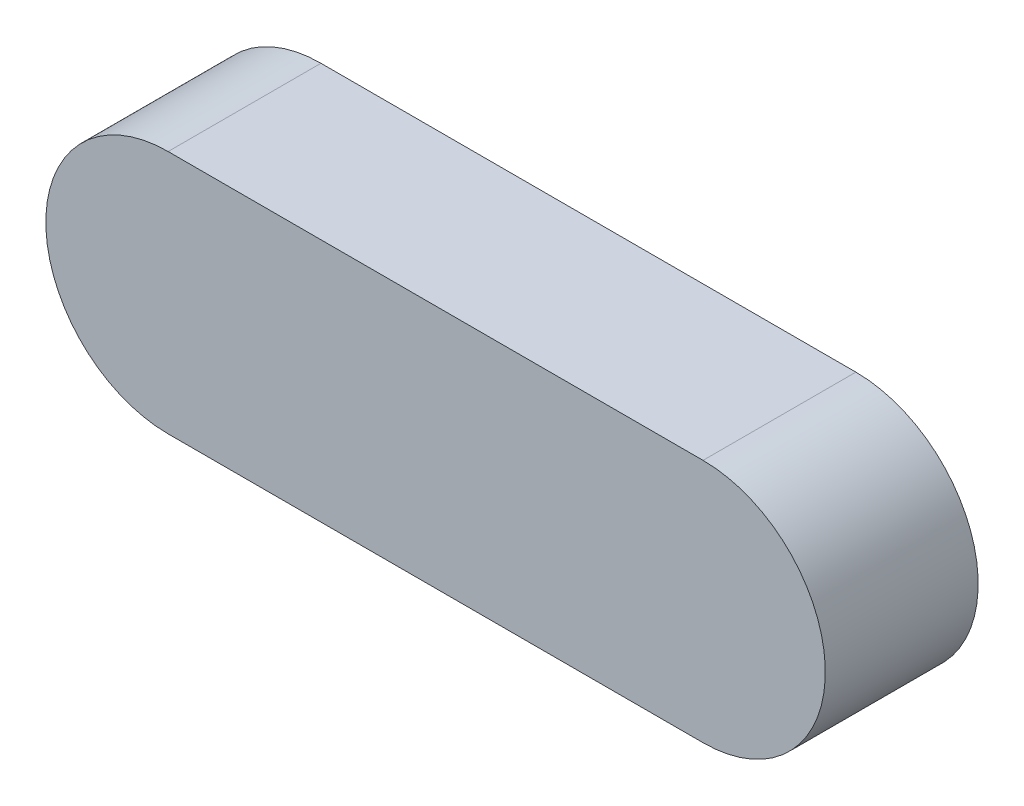
ISO-10303-21;
HEADER;
FILE_DESCRIPTION(('STEP AP214'),'2;1');
FILE_NAME('part.step','',(''),(''),'','','');
FILE_SCHEMA(('AUTOMOTIVE_DESIGN { 1 0 10303 214 1 1 1 1 }'));
ENDSEC;
DATA;
#1=APPLICATION_CONTEXT('core data for automotive mechanical design processes');
#2=APPLICATION_PROTOCOL_DEFINITION('international standard','automotive_design',2000,#1);
#3=PRODUCT_CONTEXT('',#1,'mechanical');
#4=PRODUCT('Part','Part','',(#3));
#5=PRODUCT_RELATED_PRODUCT_CATEGORY('part','',(#4));
#6=PRODUCT_DEFINITION_FORMATION('','',#4);
#7=PRODUCT_DEFINITION_CONTEXT('part definition',#1,'design');
#8=PRODUCT_DEFINITION('design','',#6,#7);
#9=PRODUCT_DEFINITION_SHAPE('','',#8);
#10=(LENGTH_UNIT() NAMED_UNIT(*) SI_UNIT(.MILLI.,.METRE.));
#11=(NAMED_UNIT(*) PLANE_ANGLE_UNIT() SI_UNIT($,.RADIAN.));
#12=(NAMED_UNIT(*) SI_UNIT($,.STERADIAN.) SOLID_ANGLE_UNIT());
#13=UNCERTAINTY_MEASURE_WITH_UNIT(LENGTH_MEASURE(1.E-05),#10,'distance_accuracy_value','');
#14=(GEOMETRIC_REPRESENTATION_CONTEXT(3) GLOBAL_UNCERTAINTY_ASSIGNED_CONTEXT((#13)) GLOBAL_UNIT_ASSIGNED_CONTEXT((#10,
#11,#12)) REPRESENTATION_CONTEXT('',''));
#15=CARTESIAN_POINT('',(0.,0.,0.));
#16=DIRECTION('',(0.,0.,1.));
#17=DIRECTION('',(1.,0.,0.));
#18=AXIS2_PLACEMENT_3D('',#15,#16,#17);
#19=CARTESIAN_POINT('',(-35.,0.,20.));
#20=DIRECTION('',(0.,0.,-1.));
#21=DIRECTION('',(-1.,0.,0.));
#22=AXIS2_PLACEMENT_3D('',#19,#20,#21);
#23=CYLINDRICAL_SURFACE('',#22,16.);
#24=CARTESIAN_POINT('',(-35.,0.,0.));
#25=DIRECTION('',(0.,0.,1.));
#26=DIRECTION('',(1.,0.,0.));
#27=AXIS2_PLACEMENT_3D('',#24,#25,#26);
#28=CIRCLE('',#27,16.);
#29=CARTESIAN_POINT('',(-35.,16.,0.));
#30=VERTEX_POINT('',#29);
#31=CARTESIAN_POINT('',(-35.,-16.,0.));
#32=VERTEX_POINT('',#31);
#33=EDGE_CURVE('E96',#30,#32,#28,.T.);
#34=ORIENTED_EDGE('',*,*,#33,.T.);
#35=DIRECTION('',(0.,0.,-1.));
#36=VECTOR('',#35,1.);
#37=CARTESIAN_POINT('',(-35.,-16.,20.));
#38=LINE('',#37,#36);
#39=CARTESIAN_POINT('',(-35.,-16.,20.));
#40=VERTEX_POINT('',#39);
#41=EDGE_CURVE('E11',#40,#32,#38,.T.);
#42=ORIENTED_EDGE('',*,*,#41,.F.);
#43=CARTESIAN_POINT('',(-35.,0.,20.));
#44=DIRECTION('',(0.,0.,1.));
#45=DIRECTION('',(1.,0.,0.));
#46=AXIS2_PLACEMENT_3D('',#43,#44,#45);
#47=CIRCLE('',#46,16.);
#48=CARTESIAN_POINT('',(-35.,16.,20.));
#49=VERTEX_POINT('',#48);
#50=EDGE_CURVE('E84',#49,#40,#47,.T.);
#51=ORIENTED_EDGE('',*,*,#50,.F.);
#52=DIRECTION('',(0.,0.,-1.));
#53=VECTOR('',#52,1.);
#54=CARTESIAN_POINT('',(-35.,16.,20.));
#55=LINE('',#54,#53);
#56=EDGE_CURVE('E92',#49,#30,#55,.T.);
#57=ORIENTED_EDGE('',*,*,#56,.T.);
#58=EDGE_LOOP('',(#34,#42,#51,#57));
#59=FACE_BOUND('',#58,.T.);
#60=ADVANCED_FACE('F33',(#59),#23,.T.);
#61=CARTESIAN_POINT('',(-35.,-16.,20.));
#62=DIRECTION('',(0.,1.,0.));
#63=DIRECTION('',(0.,0.,1.));
#64=AXIS2_PLACEMENT_3D('',#61,#62,#63);
#65=PLANE('',#64);
#66=DIRECTION('',(1.,0.,0.));
#67=VECTOR('',#66,1.);
#68=CARTESIAN_POINT('',(-35.,-16.,0.));
#69=LINE('',#68,#67);
#70=CARTESIAN_POINT('',(35.,-16.,0.));
#71=VERTEX_POINT('',#70);
#72=EDGE_CURVE('E88',#32,#71,#69,.T.);
#73=ORIENTED_EDGE('',*,*,#72,.T.);
#74=DIRECTION('',(0.,0.,-1.));
#75=VECTOR('',#74,1.);
#76=CARTESIAN_POINT('',(35.,-16.,20.));
#77=LINE('',#76,#75);
#78=CARTESIAN_POINT('',(35.,-16.,20.));
#79=VERTEX_POINT('',#78);
#80=EDGE_CURVE('E41',#79,#71,#77,.T.);
#81=ORIENTED_EDGE('',*,*,#80,.F.);
#82=DIRECTION('',(1.,0.,0.));
#83=VECTOR('',#82,1.);
#84=CARTESIAN_POINT('',(-35.,-16.,20.));
#85=LINE('',#84,#83);
#86=EDGE_CURVE('E79',#40,#79,#85,.T.);
#87=ORIENTED_EDGE('',*,*,#86,.F.);
#88=ORIENTED_EDGE('',*,*,#41,.T.);
#89=EDGE_LOOP('',(#73,#81,#87,#88));
#90=FACE_BOUND('',#89,.T.);
#91=ADVANCED_FACE('F87',(#90),#65,.F.);
#92=CARTESIAN_POINT('',(35.,0.,20.));
#93=DIRECTION('',(0.,0.,-1.));
#94=DIRECTION('',(-1.,0.,0.));
#95=AXIS2_PLACEMENT_3D('',#92,#93,#94);
#96=CYLINDRICAL_SURFACE('',#95,16.);
#97=CARTESIAN_POINT('',(35.,0.,0.));
#98=DIRECTION('',(0.,0.,1.));
#99=DIRECTION('',(-1.,0.,0.));
#100=AXIS2_PLACEMENT_3D('',#97,#98,#99);
#101=CIRCLE('',#100,16.);
#102=CARTESIAN_POINT('',(35.,16.,0.));
#103=VERTEX_POINT('',#102);
#104=EDGE_CURVE('E66',#71,#103,#101,.T.);
#105=ORIENTED_EDGE('',*,*,#104,.T.);
#106=DIRECTION('',(0.,0.,-1.));
#107=VECTOR('',#106,1.);
#108=CARTESIAN_POINT('',(35.,16.,20.));
#109=LINE('',#108,#107);
#110=CARTESIAN_POINT('',(35.,16.,20.));
#111=VERTEX_POINT('',#110);
#112=EDGE_CURVE('E89',#111,#103,#109,.T.);
#113=ORIENTED_EDGE('',*,*,#112,.F.);
#114=CARTESIAN_POINT('',(35.,0.,20.));
#115=DIRECTION('',(0.,0.,1.));
#116=DIRECTION('',(-1.,0.,0.));
#117=AXIS2_PLACEMENT_3D('',#114,#115,#116);
#118=CIRCLE('',#117,16.);
#119=EDGE_CURVE('E82',#79,#111,#118,.T.);
#120=ORIENTED_EDGE('',*,*,#119,.F.);
#121=ORIENTED_EDGE('',*,*,#80,.T.);
#122=EDGE_LOOP('',(#105,#113,#120,#121));
#123=FACE_BOUND('',#122,.T.);
#124=ADVANCED_FACE('F90',(#123),#96,.T.);
#125=CARTESIAN_POINT('',(-35.,16.,20.));
#126=DIRECTION('',(0.,-1.,0.));
#127=DIRECTION('',(0.,0.,-1.));
#128=AXIS2_PLACEMENT_3D('',#125,#126,#127);
#129=PLANE('',#128);
#130=DIRECTION('',(-1.,0.,0.));
#131=VECTOR('',#130,1.);
#132=CARTESIAN_POINT('',(-35.,16.,0.));
#133=LINE('',#132,#131);
#134=EDGE_CURVE('E72',#103,#30,#133,.T.);
#135=ORIENTED_EDGE('',*,*,#134,.T.);
#136=ORIENTED_EDGE('',*,*,#56,.F.);
#137=DIRECTION('',(-1.,0.,0.));
#138=VECTOR('',#137,1.);
#139=CARTESIAN_POINT('',(-35.,16.,20.));
#140=LINE('',#139,#138);
#141=EDGE_CURVE('E49',#111,#49,#140,.T.);
#142=ORIENTED_EDGE('',*,*,#141,.F.);
#143=ORIENTED_EDGE('',*,*,#112,.T.);
#144=EDGE_LOOP('',(#135,#136,#142,#143));
#145=FACE_BOUND('',#144,.T.);
#146=ADVANCED_FACE('F103',(#145),#129,.F.);
#147=CARTESIAN_POINT('',(-35.,0.,20.));
#148=DIRECTION('',(0.,0.,1.));
#149=DIRECTION('',(1.,0.,0.));
#150=AXIS2_PLACEMENT_3D('',#147,#148,#149);
#151=PLANE('',#150);
#152=ORIENTED_EDGE('',*,*,#50,.T.);
#153=ORIENTED_EDGE('',*,*,#86,.T.);
#154=ORIENTED_EDGE('',*,*,#119,.T.);
#155=ORIENTED_EDGE('',*,*,#141,.T.);
#156=EDGE_LOOP('',(#152,#153,#154,#155));
#157=FACE_BOUND('',#156,.T.);
#158=ADVANCED_FACE('F80',(#157),#151,.T.);
#159=CARTESIAN_POINT('',(-35.,0.,0.));
#160=DIRECTION('',(0.,0.,1.));
#161=DIRECTION('',(1.,0.,0.));
#162=AXIS2_PLACEMENT_3D('',#159,#160,#161);
#163=PLANE('',#162);
#164=ORIENTED_EDGE('',*,*,#33,.F.);
#165=ORIENTED_EDGE('',*,*,#134,.F.);
#166=ORIENTED_EDGE('',*,*,#104,.F.);
#167=ORIENTED_EDGE('',*,*,#72,.F.);
#168=EDGE_LOOP('',(#164,#165,#166,#167));
#169=FACE_BOUND('',#168,.T.);
#170=ADVANCED_FACE('F106',(#169),#163,.F.);
#171=CLOSED_SHELL('',(#60,#91,#124,#146,#158,#170));
#172=MANIFOLD_SOLID_BREP('B2',#171);
#173=ADVANCED_BREP_SHAPE_REPRESENTATION('',(#18,#172),#14);
#174=SHAPE_DEFINITION_REPRESENTATION(#9,#173);
ENDSEC;
END-ISO-10303-21;
